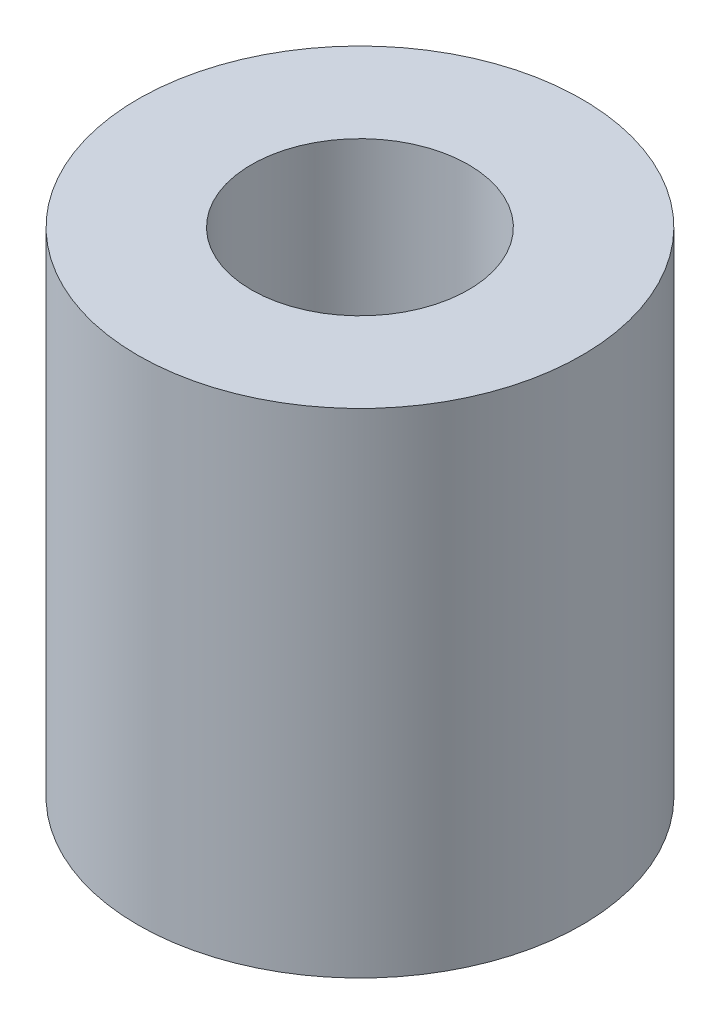
ISO-10303-21;
HEADER;
FILE_DESCRIPTION(('STEP AP214'),'2;1');
FILE_NAME('part.step','',(''),(''),'','','');
FILE_SCHEMA(('AUTOMOTIVE_DESIGN { 1 0 10303 214 1 1 1 1 }'));
ENDSEC;
DATA;
#1=APPLICATION_CONTEXT('core data for automotive mechanical design processes');
#2=APPLICATION_PROTOCOL_DEFINITION('international standard','automotive_design',2000,#1);
#3=PRODUCT_CONTEXT('',#1,'mechanical');
#4=PRODUCT('Part','Part','',(#3));
#5=PRODUCT_RELATED_PRODUCT_CATEGORY('part','',(#4));
#6=PRODUCT_DEFINITION_FORMATION('','',#4);
#7=PRODUCT_DEFINITION_CONTEXT('part definition',#1,'design');
#8=PRODUCT_DEFINITION('design','',#6,#7);
#9=PRODUCT_DEFINITION_SHAPE('','',#8);
#10=(LENGTH_UNIT() NAMED_UNIT(*) SI_UNIT(.MILLI.,.METRE.));
#11=(NAMED_UNIT(*) PLANE_ANGLE_UNIT() SI_UNIT($,.RADIAN.));
#12=(NAMED_UNIT(*) SI_UNIT($,.STERADIAN.) SOLID_ANGLE_UNIT());
#13=UNCERTAINTY_MEASURE_WITH_UNIT(LENGTH_MEASURE(1.E-05),#10,'distance_accuracy_value','');
#14=(GEOMETRIC_REPRESENTATION_CONTEXT(3) GLOBAL_UNCERTAINTY_ASSIGNED_CONTEXT((#13)) GLOBAL_UNIT_ASSIGNED_CONTEXT((#10,
#11,#12)) REPRESENTATION_CONTEXT('',''));
#15=CARTESIAN_POINT('',(0.,0.,0.));
#16=DIRECTION('',(0.,0.,1.));
#17=DIRECTION('',(1.,0.,0.));
#18=AXIS2_PLACEMENT_3D('',#15,#16,#17);
#19=CARTESIAN_POINT('',(0.,5.,0.));
#20=DIRECTION('',(0.,1.,0.));
#21=DIRECTION('',(0.,0.,1.));
#22=AXIS2_PLACEMENT_3D('',#19,#20,#21);
#23=PLANE('',#22);
#24=CARTESIAN_POINT('',(0.,5.,0.));
#25=DIRECTION('',(0.,1.,0.));
#26=DIRECTION('',(0.,0.,1.));
#27=AXIS2_PLACEMENT_3D('',#24,#25,#26);
#28=CIRCLE('',#27,2.25);
#29=CARTESIAN_POINT('',(0.,5.,2.25));
#30=VERTEX_POINT('',#29);
#31=EDGE_CURVE('E10',#30,#30,#28,.T.);
#32=ORIENTED_EDGE('',*,*,#31,.T.);
#33=EDGE_LOOP('',(#32));
#34=FACE_BOUND('',#33,.T.);
#35=CARTESIAN_POINT('',(0.,5.,0.));
#36=DIRECTION('',(0.,1.,0.));
#37=DIRECTION('',(0.,0.,1.));
#38=AXIS2_PLACEMENT_3D('',#35,#36,#37);
#39=CIRCLE('',#38,1.1);
#40=CARTESIAN_POINT('',(0.,5.,1.1));
#41=VERTEX_POINT('',#40);
#42=EDGE_CURVE('E50',#41,#41,#39,.T.);
#43=ORIENTED_EDGE('',*,*,#42,.F.);
#44=EDGE_LOOP('',(#43));
#45=FACE_BOUND('',#44,.T.);
#46=ADVANCED_FACE('F37',(#34,#45),#23,.T.);
#47=CARTESIAN_POINT('',(0.,0.,0.));
#48=DIRECTION('',(0.,1.,0.));
#49=DIRECTION('',(0.,0.,1.));
#50=AXIS2_PLACEMENT_3D('',#47,#48,#49);
#51=PLANE('',#50);
#52=CARTESIAN_POINT('',(0.,0.,0.));
#53=DIRECTION('',(0.,1.,0.));
#54=DIRECTION('',(0.,0.,1.));
#55=AXIS2_PLACEMENT_3D('',#52,#53,#54);
#56=CIRCLE('',#55,2.25);
#57=CARTESIAN_POINT('',(0.,0.,2.25));
#58=VERTEX_POINT('',#57);
#59=EDGE_CURVE('E41',#58,#58,#56,.T.);
#60=ORIENTED_EDGE('',*,*,#59,.F.);
#61=EDGE_LOOP('',(#60));
#62=FACE_BOUND('',#61,.T.);
#63=CARTESIAN_POINT('',(0.,0.,0.));
#64=DIRECTION('',(0.,1.,0.));
#65=DIRECTION('',(0.,0.,1.));
#66=AXIS2_PLACEMENT_3D('',#63,#64,#65);
#67=CIRCLE('',#66,1.1);
#68=CARTESIAN_POINT('',(0.,0.,1.1));
#69=VERTEX_POINT('',#68);
#70=EDGE_CURVE('E52',#69,#69,#67,.T.);
#71=ORIENTED_EDGE('',*,*,#70,.T.);
#72=EDGE_LOOP('',(#71));
#73=FACE_BOUND('',#72,.T.);
#74=ADVANCED_FACE('F64',(#62,#73),#51,.F.);
#75=CARTESIAN_POINT('',(0.,5.,0.));
#76=DIRECTION('',(0.,-1.,0.));
#77=DIRECTION('',(0.,0.,-1.));
#78=AXIS2_PLACEMENT_3D('',#75,#76,#77);
#79=CYLINDRICAL_SURFACE('',#78,2.25);
#80=ORIENTED_EDGE('',*,*,#31,.F.);
#81=EDGE_LOOP('',(#80));
#82=FACE_BOUND('',#81,.T.);
#83=ORIENTED_EDGE('',*,*,#59,.T.);
#84=EDGE_LOOP('',(#83));
#85=FACE_BOUND('',#84,.T.);
#86=ADVANCED_FACE('F39',(#82,#85),#79,.T.);
#87=CARTESIAN_POINT('',(0.,5.,0.));
#88=DIRECTION('',(0.,-1.,0.));
#89=DIRECTION('',(0.,0.,-1.));
#90=AXIS2_PLACEMENT_3D('',#87,#88,#89);
#91=CYLINDRICAL_SURFACE('',#90,1.1);
#92=ORIENTED_EDGE('',*,*,#42,.T.);
#93=EDGE_LOOP('',(#92));
#94=FACE_BOUND('',#93,.T.);
#95=ORIENTED_EDGE('',*,*,#70,.F.);
#96=EDGE_LOOP('',(#95));
#97=FACE_BOUND('',#96,.T.);
#98=ADVANCED_FACE('F60',(#94,#97),#91,.F.);
#99=CLOSED_SHELL('',(#46,#74,#86,#98));
#100=MANIFOLD_SOLID_BREP('B2',#99);
#101=ADVANCED_BREP_SHAPE_REPRESENTATION('',(#18,#100),#14);
#102=SHAPE_DEFINITION_REPRESENTATION(#9,#101);
ENDSEC;
END-ISO-10303-21;
